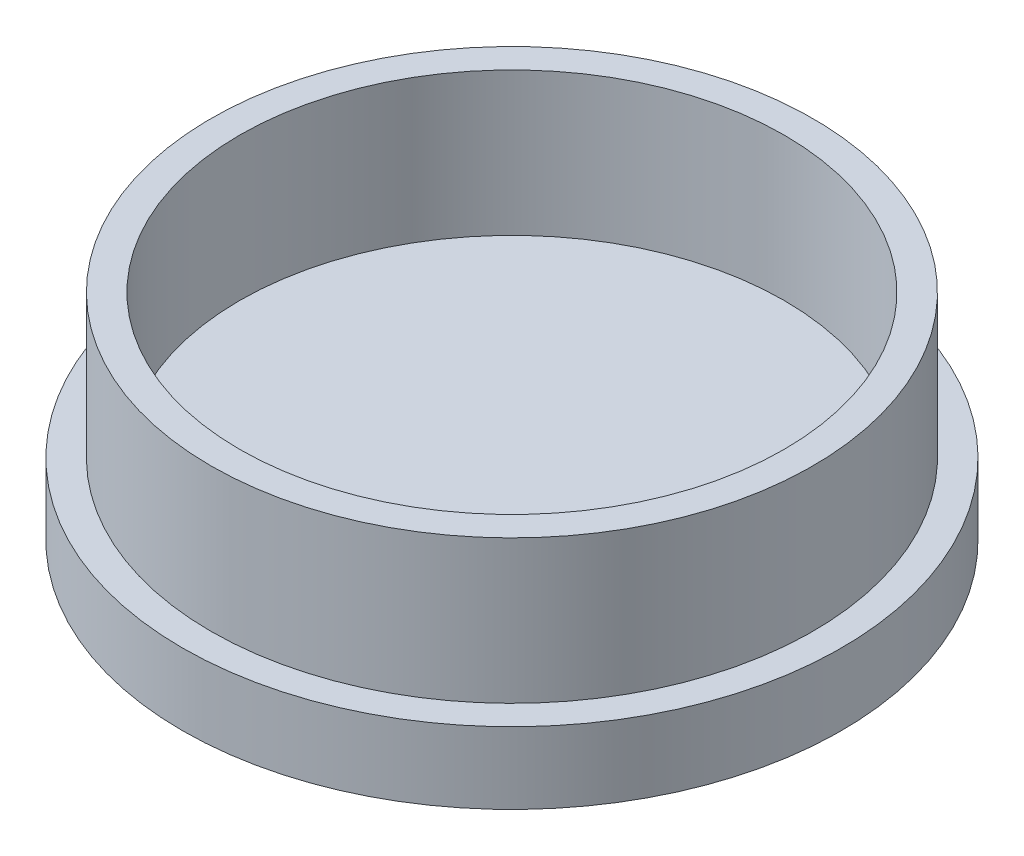
ISO-10303-21;
HEADER;
FILE_DESCRIPTION(('STEP AP214'),'2;1');
FILE_NAME('part.step','',(''),(''),'','','');
FILE_SCHEMA(('AUTOMOTIVE_DESIGN { 1 0 10303 214 1 1 1 1 }'));
ENDSEC;
DATA;
#1=APPLICATION_CONTEXT('core data for automotive mechanical design processes');
#2=APPLICATION_PROTOCOL_DEFINITION('international standard','automotive_design',2000,#1);
#3=PRODUCT_CONTEXT('',#1,'mechanical');
#4=PRODUCT('Part','Part','',(#3));
#5=PRODUCT_RELATED_PRODUCT_CATEGORY('part','',(#4));
#6=PRODUCT_DEFINITION_FORMATION('','',#4);
#7=PRODUCT_DEFINITION_CONTEXT('part definition',#1,'design');
#8=PRODUCT_DEFINITION('design','',#6,#7);
#9=PRODUCT_DEFINITION_SHAPE('','',#8);
#10=(LENGTH_UNIT() NAMED_UNIT(*) SI_UNIT(.MILLI.,.METRE.));
#11=(NAMED_UNIT(*) PLANE_ANGLE_UNIT() SI_UNIT($,.RADIAN.));
#12=(NAMED_UNIT(*) SI_UNIT($,.STERADIAN.) SOLID_ANGLE_UNIT());
#13=UNCERTAINTY_MEASURE_WITH_UNIT(LENGTH_MEASURE(1.E-05),#10,'distance_accuracy_value','');
#14=(GEOMETRIC_REPRESENTATION_CONTEXT(3) GLOBAL_UNCERTAINTY_ASSIGNED_CONTEXT((#13)) GLOBAL_UNIT_ASSIGNED_CONTEXT((#10,
#11,#12)) REPRESENTATION_CONTEXT('',''));
#15=CARTESIAN_POINT('',(0.,0.,0.));
#16=DIRECTION('',(0.,0.,1.));
#17=DIRECTION('',(1.,0.,0.));
#18=AXIS2_PLACEMENT_3D('',#15,#16,#17);
#19=CARTESIAN_POINT('',(0.,5.,0.));
#20=DIRECTION('',(0.,-1.,0.));
#21=DIRECTION('',(0.,0.,-1.));
#22=AXIS2_PLACEMENT_3D('',#19,#20,#21);
#23=CYLINDRICAL_SURFACE('',#22,23.);
#24=CARTESIAN_POINT('',(0.,5.,0.));
#25=DIRECTION('',(0.,1.,0.));
#26=DIRECTION('',(0.,0.,1.));
#27=AXIS2_PLACEMENT_3D('',#24,#25,#26);
#28=CIRCLE('',#27,23.);
#29=CARTESIAN_POINT('',(0.,5.,23.));
#30=VERTEX_POINT('',#29);
#31=EDGE_CURVE('E40',#30,#30,#28,.T.);
#32=ORIENTED_EDGE('',*,*,#31,.F.);
#33=EDGE_LOOP('',(#32));
#34=FACE_BOUND('',#33,.T.);
#35=CARTESIAN_POINT('',(0.,0.,0.));
#36=DIRECTION('',(0.,1.,0.));
#37=DIRECTION('',(0.,0.,1.));
#38=AXIS2_PLACEMENT_3D('',#35,#36,#37);
#39=CIRCLE('',#38,23.);
#40=CARTESIAN_POINT('',(0.,0.,23.));
#41=VERTEX_POINT('',#40);
#42=EDGE_CURVE('E44',#41,#41,#39,.T.);
#43=ORIENTED_EDGE('',*,*,#42,.T.);
#44=EDGE_LOOP('',(#43));
#45=FACE_BOUND('',#44,.T.);
#46=ADVANCED_FACE('F34',(#34,#45),#23,.T.);
#47=CARTESIAN_POINT('',(0.,5.,0.));
#48=DIRECTION('',(0.,1.,0.));
#49=DIRECTION('',(0.,0.,1.));
#50=AXIS2_PLACEMENT_3D('',#47,#48,#49);
#51=PLANE('',#50);
#52=CARTESIAN_POINT('',(0.,5.,0.));
#53=DIRECTION('',(0.,1.,0.));
#54=DIRECTION('',(0.,0.,1.));
#55=AXIS2_PLACEMENT_3D('',#52,#53,#54);
#56=CIRCLE('',#55,21.);
#57=CARTESIAN_POINT('',(0.,5.,21.));
#58=VERTEX_POINT('',#57);
#59=EDGE_CURVE('E51',#58,#58,#56,.T.);
#60=ORIENTED_EDGE('',*,*,#59,.F.);
#61=EDGE_LOOP('',(#60));
#62=FACE_BOUND('',#61,.T.);
#63=ORIENTED_EDGE('',*,*,#31,.T.);
#64=EDGE_LOOP('',(#63));
#65=FACE_BOUND('',#64,.T.);
#66=ADVANCED_FACE('F74',(#62,#65),#51,.T.);
#67=CARTESIAN_POINT('',(0.,0.,0.));
#68=DIRECTION('',(0.,1.,0.));
#69=DIRECTION('',(0.,0.,1.));
#70=AXIS2_PLACEMENT_3D('',#67,#68,#69);
#71=PLANE('',#70);
#72=ORIENTED_EDGE('',*,*,#42,.F.);
#73=EDGE_LOOP('',(#72));
#74=FACE_BOUND('',#73,.T.);
#75=ADVANCED_FACE('F65',(#74),#71,.F.);
#76=CARTESIAN_POINT('',(0.,15.,0.));
#77=DIRECTION('',(0.,1.,0.));
#78=DIRECTION('',(0.,0.,1.));
#79=AXIS2_PLACEMENT_3D('',#76,#77,#78);
#80=PLANE('',#79);
#81=CARTESIAN_POINT('',(0.,15.,0.));
#82=DIRECTION('',(0.,1.,0.));
#83=DIRECTION('',(0.,0.,1.));
#84=AXIS2_PLACEMENT_3D('',#81,#82,#83);
#85=CIRCLE('',#84,21.);
#86=CARTESIAN_POINT('',(0.,15.,21.));
#87=VERTEX_POINT('',#86);
#88=EDGE_CURVE('E49',#87,#87,#85,.T.);
#89=ORIENTED_EDGE('',*,*,#88,.T.);
#90=EDGE_LOOP('',(#89));
#91=FACE_BOUND('',#90,.T.);
#92=CARTESIAN_POINT('',(0.,15.,0.));
#93=DIRECTION('',(0.,1.,0.));
#94=DIRECTION('',(0.,0.,1.));
#95=AXIS2_PLACEMENT_3D('',#92,#93,#94);
#96=CIRCLE('',#95,19.);
#97=CARTESIAN_POINT('',(0.,15.,19.));
#98=VERTEX_POINT('',#97);
#99=EDGE_CURVE('E54',#98,#98,#96,.T.);
#100=ORIENTED_EDGE('',*,*,#99,.F.);
#101=EDGE_LOOP('',(#100));
#102=FACE_BOUND('',#101,.T.);
#103=ADVANCED_FACE('F62',(#91,#102),#80,.T.);
#104=CARTESIAN_POINT('',(0.,15.,0.));
#105=DIRECTION('',(0.,-1.,0.));
#106=DIRECTION('',(0.,0.,-1.));
#107=AXIS2_PLACEMENT_3D('',#104,#105,#106);
#108=CYLINDRICAL_SURFACE('',#107,21.);
#109=ORIENTED_EDGE('',*,*,#88,.F.);
#110=EDGE_LOOP('',(#109));
#111=FACE_BOUND('',#110,.T.);
#112=ORIENTED_EDGE('',*,*,#59,.T.);
#113=EDGE_LOOP('',(#112));
#114=FACE_BOUND('',#113,.T.);
#115=ADVANCED_FACE('F64',(#111,#114),#108,.T.);
#116=CARTESIAN_POINT('',(0.,15.,0.));
#117=DIRECTION('',(0.,-1.,0.));
#118=DIRECTION('',(0.,0.,-1.));
#119=AXIS2_PLACEMENT_3D('',#116,#117,#118);
#120=CYLINDRICAL_SURFACE('',#119,19.);
#121=ORIENTED_EDGE('',*,*,#99,.T.);
#122=EDGE_LOOP('',(#121));
#123=FACE_BOUND('',#122,.T.);
#124=CARTESIAN_POINT('',(0.,5.,0.));
#125=DIRECTION('',(0.,1.,0.));
#126=DIRECTION('',(0.,0.,1.));
#127=AXIS2_PLACEMENT_3D('',#124,#125,#126);
#128=CIRCLE('',#127,19.);
#129=CARTESIAN_POINT('',(0.,5.,19.));
#130=VERTEX_POINT('',#129);
#131=EDGE_CURVE('E10',#130,#130,#128,.F.);
#132=ORIENTED_EDGE('',*,*,#131,.T.);
#133=EDGE_LOOP('',(#132));
#134=FACE_BOUND('',#133,.T.);
#135=ADVANCED_FACE('F60',(#123,#134),#120,.F.);
#136=ORIENTED_EDGE('',*,*,#131,.F.);
#137=EDGE_LOOP('',(#136));
#138=FACE_BOUND('',#137,.T.);
#139=ADVANCED_FACE('F84',(#138),#51,.T.);
#140=CLOSED_SHELL('',(#46,#66,#75,#103,#115,#135,#139));
#141=MANIFOLD_SOLID_BREP('B2',#140);
#142=ADVANCED_BREP_SHAPE_REPRESENTATION('',(#18,#141),#14);
#143=SHAPE_DEFINITION_REPRESENTATION(#9,#142);
ENDSEC;
END-ISO-10303-21;
